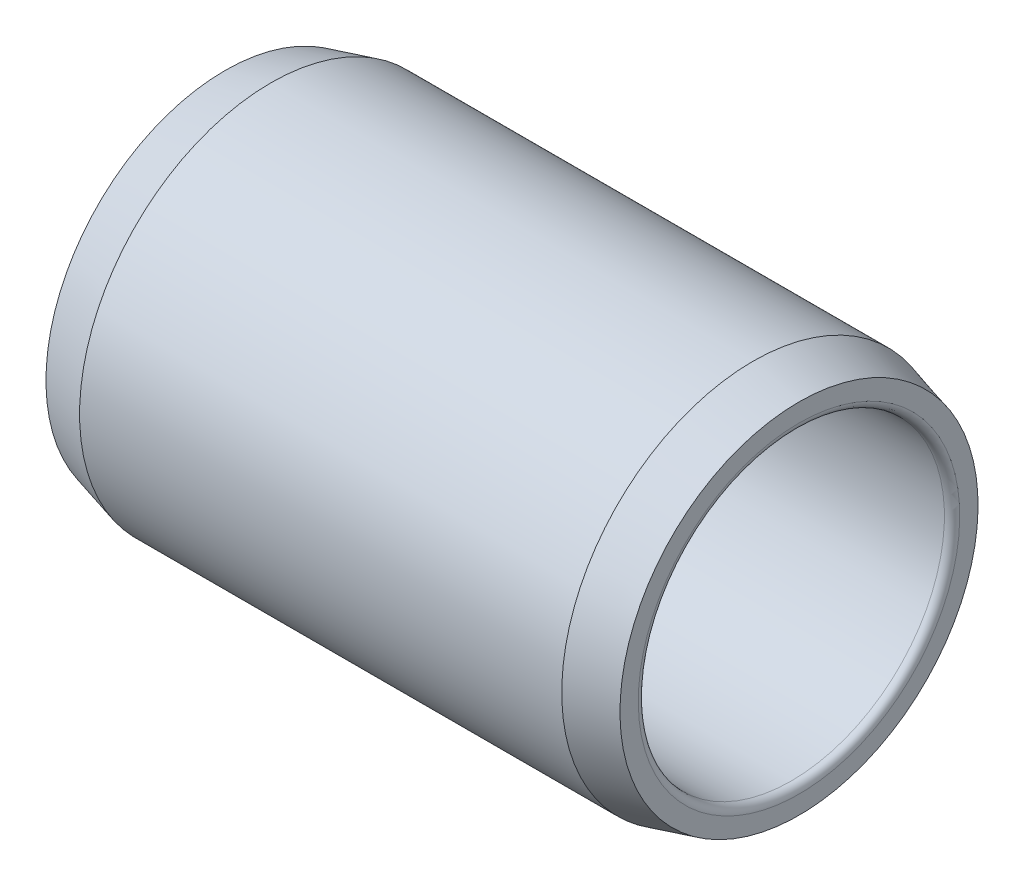
ISO-10303-21;
HEADER;
FILE_DESCRIPTION(('STEP AP214'),'2;1');
FILE_NAME('part.step','',(''),(''),'','','');
FILE_SCHEMA(('AUTOMOTIVE_DESIGN { 1 0 10303 214 1 1 1 1 }'));
ENDSEC;
DATA;
#1=APPLICATION_CONTEXT('core data for automotive mechanical design processes');
#2=APPLICATION_PROTOCOL_DEFINITION('international standard','automotive_design',2000,#1);
#3=PRODUCT_CONTEXT('',#1,'mechanical');
#4=PRODUCT('Part','Part','',(#3));
#5=PRODUCT_RELATED_PRODUCT_CATEGORY('part','',(#4));
#6=PRODUCT_DEFINITION_FORMATION('','',#4);
#7=PRODUCT_DEFINITION_CONTEXT('part definition',#1,'design');
#8=PRODUCT_DEFINITION('design','',#6,#7);
#9=PRODUCT_DEFINITION_SHAPE('','',#8);
#10=(LENGTH_UNIT() NAMED_UNIT(*) SI_UNIT(.MILLI.,.METRE.));
#11=(NAMED_UNIT(*) PLANE_ANGLE_UNIT() SI_UNIT($,.RADIAN.));
#12=(NAMED_UNIT(*) SI_UNIT($,.STERADIAN.) SOLID_ANGLE_UNIT());
#13=UNCERTAINTY_MEASURE_WITH_UNIT(LENGTH_MEASURE(1.E-05),#10,'distance_accuracy_value','');
#14=(GEOMETRIC_REPRESENTATION_CONTEXT(3) GLOBAL_UNCERTAINTY_ASSIGNED_CONTEXT((#13)) GLOBAL_UNIT_ASSIGNED_CONTEXT((#10,
#11,#12)) REPRESENTATION_CONTEXT('',''));
#15=CARTESIAN_POINT('',(0.,0.,0.));
#16=DIRECTION('',(0.,0.,1.));
#17=DIRECTION('',(1.,0.,0.));
#18=AXIS2_PLACEMENT_3D('',#15,#16,#17);
#19=CARTESIAN_POINT('',(22.2,0.,0.));
#20=DIRECTION('',(1.,0.,0.));
#21=DIRECTION('',(0.,0.,-1.));
#22=AXIS2_PLACEMENT_3D('',#19,#20,#21);
#23=TOROIDAL_SURFACE('',#22,6.3,0.3);
#24=CARTESIAN_POINT('',(22.5,0.,0.));
#25=DIRECTION('',(1.,0.,0.));
#26=DIRECTION('',(0.,1.,0.));
#27=AXIS2_PLACEMENT_3D('',#24,#25,#26);
#28=CIRCLE('',#27,6.3);
#29=CARTESIAN_POINT('',(22.5,6.3,0.));
#30=VERTEX_POINT('',#29);
#31=EDGE_CURVE('E11',#30,#30,#28,.T.);
#32=ORIENTED_EDGE('',*,*,#31,.T.);
#33=EDGE_LOOP('',(#32));
#34=FACE_BOUND('',#33,.T.);
#35=CARTESIAN_POINT('',(22.2,0.,0.));
#36=DIRECTION('',(1.,0.,0.));
#37=DIRECTION('',(0.,1.,0.));
#38=AXIS2_PLACEMENT_3D('',#35,#36,#37);
#39=CIRCLE('',#38,6.);
#40=CARTESIAN_POINT('',(22.2,6.,0.));
#41=VERTEX_POINT('',#40);
#42=EDGE_CURVE('E66',#41,#41,#39,.T.);
#43=ORIENTED_EDGE('',*,*,#42,.F.);
#44=EDGE_LOOP('',(#43));
#45=FACE_BOUND('',#44,.T.);
#46=ADVANCED_FACE('F16',(#34,#45),#23,.T.);
#47=CARTESIAN_POINT('',(22.5,6.65884572681199,0.));
#48=DIRECTION('',(1.,0.,0.));
#49=DIRECTION('',(0.,1.,0.));
#50=AXIS2_PLACEMENT_3D('',#47,#48,#49);
#51=PLANE('',#50);
#52=CARTESIAN_POINT('',(22.5,0.,0.));
#53=DIRECTION('',(1.,0.,0.));
#54=DIRECTION('',(0.,1.,0.));
#55=AXIS2_PLACEMENT_3D('',#52,#53,#54);
#56=CIRCLE('',#55,7.01769145362398);
#57=CARTESIAN_POINT('',(22.5,7.01769145362398,0.));
#58=VERTEX_POINT('',#57);
#59=EDGE_CURVE('E26',#58,#58,#56,.T.);
#60=ORIENTED_EDGE('',*,*,#59,.T.);
#61=EDGE_LOOP('',(#60));
#62=FACE_BOUND('',#61,.T.);
#63=ORIENTED_EDGE('',*,*,#31,.F.);
#64=EDGE_LOOP('',(#63));
#65=FACE_BOUND('',#64,.T.);
#66=ADVANCED_FACE('F87',(#62,#65),#51,.T.);
#67=CARTESIAN_POINT('',(21.6,0.,0.));
#68=DIRECTION('',(-1.,0.,0.));
#69=DIRECTION('',(0.,1.,0.));
#70=AXIS2_PLACEMENT_3D('',#67,#68,#69);
#71=CONICAL_SURFACE('',#70,7.25884572681199,0.261799387799149);
#72=CARTESIAN_POINT('',(20.7,0.,0.));
#73=DIRECTION('',(1.,0.,0.));
#74=DIRECTION('',(0.,1.,0.));
#75=AXIS2_PLACEMENT_3D('',#72,#73,#74);
#76=CIRCLE('',#75,7.5);
#77=CARTESIAN_POINT('',(20.7,7.5,0.));
#78=VERTEX_POINT('',#77);
#79=EDGE_CURVE('E80',#78,#78,#76,.T.);
#80=ORIENTED_EDGE('',*,*,#79,.T.);
#81=EDGE_LOOP('',(#80));
#82=FACE_BOUND('',#81,.T.);
#83=ORIENTED_EDGE('',*,*,#59,.F.);
#84=EDGE_LOOP('',(#83));
#85=FACE_BOUND('',#84,.T.);
#86=ADVANCED_FACE('F90',(#82,#85),#71,.T.);
#87=CARTESIAN_POINT('',(11.25,0.,0.));
#88=DIRECTION('',(-1.,0.,0.));
#89=DIRECTION('',(0.,1.,0.));
#90=AXIS2_PLACEMENT_3D('',#87,#88,#89);
#91=CYLINDRICAL_SURFACE('',#90,7.5);
#92=CARTESIAN_POINT('',(1.8,0.,0.));
#93=DIRECTION('',(1.,0.,0.));
#94=DIRECTION('',(0.,1.,0.));
#95=AXIS2_PLACEMENT_3D('',#92,#93,#94);
#96=CIRCLE('',#95,7.5);
#97=CARTESIAN_POINT('',(1.8,7.5,0.));
#98=VERTEX_POINT('',#97);
#99=EDGE_CURVE('E48',#98,#98,#96,.T.);
#100=ORIENTED_EDGE('',*,*,#99,.T.);
#101=EDGE_LOOP('',(#100));
#102=FACE_BOUND('',#101,.T.);
#103=ORIENTED_EDGE('',*,*,#79,.F.);
#104=EDGE_LOOP('',(#103));
#105=FACE_BOUND('',#104,.T.);
#106=ADVANCED_FACE('F92',(#102,#105),#91,.T.);
#107=CARTESIAN_POINT('',(0.9,0.,0.));
#108=DIRECTION('',(1.,0.,0.));
#109=DIRECTION('',(0.,1.,0.));
#110=AXIS2_PLACEMENT_3D('',#107,#108,#109);
#111=CONICAL_SURFACE('',#110,7.25884572681199,0.261799387799149);
#112=CARTESIAN_POINT('',(0.,0.,0.));
#113=DIRECTION('',(1.,0.,0.));
#114=DIRECTION('',(0.,1.,0.));
#115=AXIS2_PLACEMENT_3D('',#112,#113,#114);
#116=CIRCLE('',#115,7.01769145362398);
#117=CARTESIAN_POINT('',(0.,7.01769145362398,0.));
#118=VERTEX_POINT('',#117);
#119=EDGE_CURVE('E57',#118,#118,#116,.T.);
#120=ORIENTED_EDGE('',*,*,#119,.T.);
#121=EDGE_LOOP('',(#120));
#122=FACE_BOUND('',#121,.T.);
#123=ORIENTED_EDGE('',*,*,#99,.F.);
#124=EDGE_LOOP('',(#123));
#125=FACE_BOUND('',#124,.T.);
#126=ADVANCED_FACE('F101',(#122,#125),#111,.T.);
#127=CARTESIAN_POINT('',(0.,6.65884572681199,0.));
#128=DIRECTION('',(-1.,0.,0.));
#129=DIRECTION('',(0.,-1.,0.));
#130=AXIS2_PLACEMENT_3D('',#127,#128,#129);
#131=PLANE('',#130);
#132=CARTESIAN_POINT('',(0.,0.,0.));
#133=DIRECTION('',(1.,0.,0.));
#134=DIRECTION('',(0.,1.,0.));
#135=AXIS2_PLACEMENT_3D('',#132,#133,#134);
#136=CIRCLE('',#135,6.3);
#137=CARTESIAN_POINT('',(0.,6.3,0.));
#138=VERTEX_POINT('',#137);
#139=EDGE_CURVE('E19',#138,#138,#136,.T.);
#140=ORIENTED_EDGE('',*,*,#139,.T.);
#141=EDGE_LOOP('',(#140));
#142=FACE_BOUND('',#141,.T.);
#143=ORIENTED_EDGE('',*,*,#119,.F.);
#144=EDGE_LOOP('',(#143));
#145=FACE_BOUND('',#144,.T.);
#146=ADVANCED_FACE('F122',(#142,#145),#131,.T.);
#147=CARTESIAN_POINT('',(0.3,0.,0.));
#148=DIRECTION('',(1.,0.,0.));
#149=DIRECTION('',(0.,0.,-1.));
#150=AXIS2_PLACEMENT_3D('',#147,#148,#149);
#151=TOROIDAL_SURFACE('',#150,6.3,0.3);
#152=CARTESIAN_POINT('',(0.3,0.,0.));
#153=DIRECTION('',(1.,0.,0.));
#154=DIRECTION('',(0.,1.,0.));
#155=AXIS2_PLACEMENT_3D('',#152,#153,#154);
#156=CIRCLE('',#155,6.);
#157=CARTESIAN_POINT('',(0.3,6.,0.));
#158=VERTEX_POINT('',#157);
#159=EDGE_CURVE('E71',#158,#158,#156,.T.);
#160=ORIENTED_EDGE('',*,*,#159,.T.);
#161=EDGE_LOOP('',(#160));
#162=FACE_BOUND('',#161,.T.);
#163=ORIENTED_EDGE('',*,*,#139,.F.);
#164=EDGE_LOOP('',(#163));
#165=FACE_BOUND('',#164,.T.);
#166=ADVANCED_FACE('F135',(#162,#165),#151,.T.);
#167=CARTESIAN_POINT('',(11.25,0.,0.));
#168=DIRECTION('',(-1.,0.,0.));
#169=DIRECTION('',(0.,1.,0.));
#170=AXIS2_PLACEMENT_3D('',#167,#168,#169);
#171=CYLINDRICAL_SURFACE('',#170,6.);
#172=ORIENTED_EDGE('',*,*,#42,.T.);
#173=EDGE_LOOP('',(#172));
#174=FACE_BOUND('',#173,.T.);
#175=ORIENTED_EDGE('',*,*,#159,.F.);
#176=EDGE_LOOP('',(#175));
#177=FACE_BOUND('',#176,.T.);
#178=ADVANCED_FACE('F67',(#174,#177),#171,.F.);
#179=CLOSED_SHELL('',(#46,#66,#86,#106,#126,#146,#166,#178));
#180=MANIFOLD_SOLID_BREP('B1',#179);
#181=ADVANCED_BREP_SHAPE_REPRESENTATION('',(#18,#180),#14);
#182=SHAPE_DEFINITION_REPRESENTATION(#9,#181);
ENDSEC;
END-ISO-10303-21;
